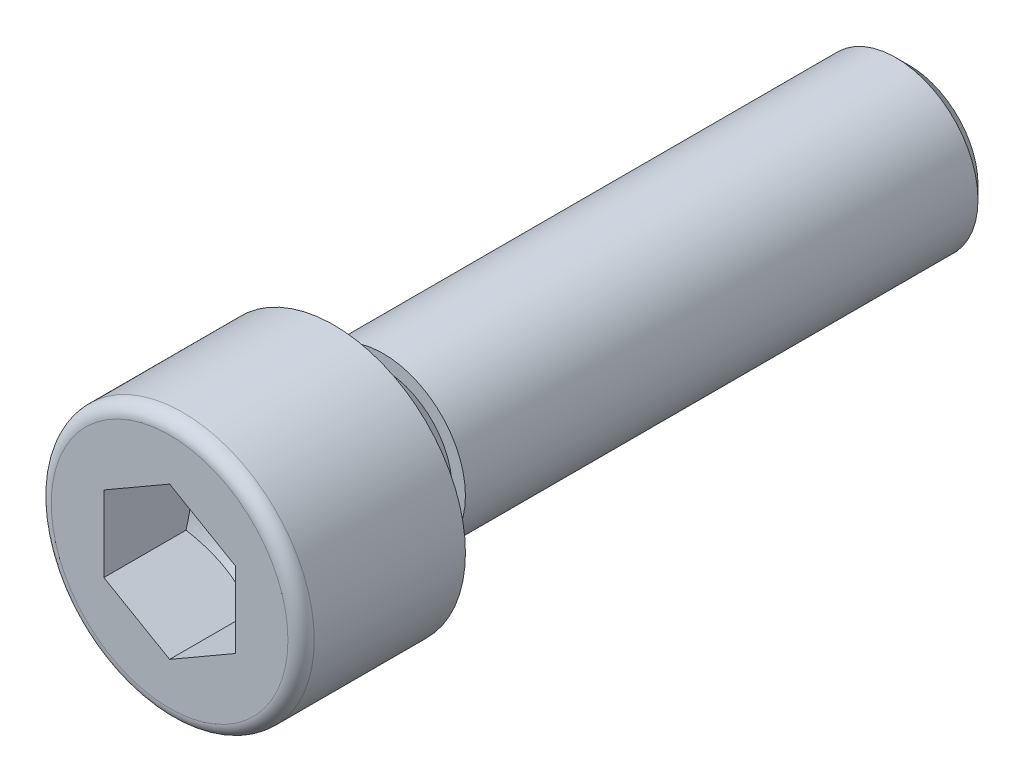
ISO-10303-21;
HEADER;
FILE_DESCRIPTION(('STEP AP214'),'2;1');
FILE_NAME('part.step','',(''),(''),'','','');
FILE_SCHEMA(('AUTOMOTIVE_DESIGN { 1 0 10303 214 1 1 1 1 }'));
ENDSEC;
DATA;
#1=APPLICATION_CONTEXT('core data for automotive mechanical design processes');
#2=APPLICATION_PROTOCOL_DEFINITION('international standard','automotive_design',2000,#1);
#3=PRODUCT_CONTEXT('',#1,'mechanical');
#4=PRODUCT('Part','Part','',(#3));
#5=PRODUCT_RELATED_PRODUCT_CATEGORY('part','',(#4));
#6=PRODUCT_DEFINITION_FORMATION('','',#4);
#7=PRODUCT_DEFINITION_CONTEXT('part definition',#1,'design');
#8=PRODUCT_DEFINITION('design','',#6,#7);
#9=PRODUCT_DEFINITION_SHAPE('','',#8);
#10=(LENGTH_UNIT() NAMED_UNIT(*) SI_UNIT(.MILLI.,.METRE.));
#11=(NAMED_UNIT(*) PLANE_ANGLE_UNIT() SI_UNIT($,.RADIAN.));
#12=(NAMED_UNIT(*) SI_UNIT($,.STERADIAN.) SOLID_ANGLE_UNIT());
#13=UNCERTAINTY_MEASURE_WITH_UNIT(LENGTH_MEASURE(1.E-05),#10,'distance_accuracy_value','');
#14=(GEOMETRIC_REPRESENTATION_CONTEXT(3) GLOBAL_UNCERTAINTY_ASSIGNED_CONTEXT((#13)) GLOBAL_UNIT_ASSIGNED_CONTEXT((#10,
#11,#12)) REPRESENTATION_CONTEXT('',''));
#15=CARTESIAN_POINT('',(0.,0.,0.));
#16=DIRECTION('',(0.,0.,1.));
#17=DIRECTION('',(1.,0.,0.));
#18=AXIS2_PLACEMENT_3D('',#15,#16,#17);
#19=CARTESIAN_POINT('',(0.,0.,10.));
#20=DIRECTION('',(0.,0.,1.));
#21=DIRECTION('',(1.,0.,0.));
#22=AXIS2_PLACEMENT_3D('',#19,#20,#21);
#23=PLANE('',#22);
#24=CARTESIAN_POINT('',(0.,0.,10.));
#25=DIRECTION('',(0.,0.,1.));
#26=DIRECTION('',(1.,0.,0.));
#27=AXIS2_PLACEMENT_3D('',#24,#25,#26);
#28=CIRCLE('',#27,7.2);
#29=CARTESIAN_POINT('',(7.2,0.,10.));
#30=VERTEX_POINT('',#29);
#31=EDGE_CURVE('E11',#30,#30,#28,.T.);
#32=ORIENTED_EDGE('',*,*,#31,.T.);
#33=EDGE_LOOP('',(#32));
#34=FACE_BOUND('',#33,.T.);
#35=DIRECTION('',(0.,-1.,0.));
#36=VECTOR('',#35,1.);
#37=CARTESIAN_POINT('',(3.99999813499956,2.3094,10.));
#38=LINE('',#37,#36);
#39=CARTESIAN_POINT('',(3.99999813499956,2.3094,10.));
#40=VERTEX_POINT('',#39);
#41=CARTESIAN_POINT('',(3.99999813499957,-2.3094,10.));
#42=VERTEX_POINT('',#41);
#43=EDGE_CURVE('E92',#40,#42,#38,.T.);
#44=ORIENTED_EDGE('',*,*,#43,.T.);
#45=DIRECTION('',(-0.866025403784438,-0.5,0.));
#46=VECTOR('',#45,1.);
#47=CARTESIAN_POINT('',(3.99999813499957,-2.3094,10.));
#48=LINE('',#47,#46);
#49=CARTESIAN_POINT('',(0.,-4.6188,10.));
#50=VERTEX_POINT('',#49);
#51=EDGE_CURVE('E31',#42,#50,#48,.T.);
#52=ORIENTED_EDGE('',*,*,#51,.T.);
#53=DIRECTION('',(-0.866025403784439,0.5,0.));
#54=VECTOR('',#53,1.);
#55=CARTESIAN_POINT('',(0.,-4.6188,10.));
#56=LINE('',#55,#54);
#57=CARTESIAN_POINT('',(-3.99999813499956,-2.3094,10.));
#58=VERTEX_POINT('',#57);
#59=EDGE_CURVE('E169',#50,#58,#56,.T.);
#60=ORIENTED_EDGE('',*,*,#59,.T.);
#61=DIRECTION('',(0.,1.,0.));
#62=VECTOR('',#61,1.);
#63=CARTESIAN_POINT('',(-3.99999813499956,-2.3094,10.));
#64=LINE('',#63,#62);
#65=CARTESIAN_POINT('',(-3.99999813499956,2.3094,10.));
#66=VERTEX_POINT('',#65);
#67=EDGE_CURVE('E165',#58,#66,#64,.T.);
#68=ORIENTED_EDGE('',*,*,#67,.T.);
#69=DIRECTION('',(0.866025403784439,0.5,0.));
#70=VECTOR('',#69,1.);
#71=CARTESIAN_POINT('',(-3.99999813499956,2.3094,10.));
#72=LINE('',#71,#70);
#73=CARTESIAN_POINT('',(0.,4.6188,10.));
#74=VERTEX_POINT('',#73);
#75=EDGE_CURVE('E160',#66,#74,#72,.T.);
#76=ORIENTED_EDGE('',*,*,#75,.T.);
#77=DIRECTION('',(0.866025403784439,-0.5,0.));
#78=VECTOR('',#77,1.);
#79=CARTESIAN_POINT('',(0.,4.6188,10.));
#80=LINE('',#79,#78);
#81=EDGE_CURVE('E96',#74,#40,#80,.T.);
#82=ORIENTED_EDGE('',*,*,#81,.T.);
#83=EDGE_LOOP('',(#44,#52,#60,#68,#76,#82));
#84=FACE_BOUND('',#83,.T.);
#85=ADVANCED_FACE('F17',(#34,#84),#23,.T.);
#86=CARTESIAN_POINT('',(0.,0.,9.2));
#87=DIRECTION('',(0.,0.,1.));
#88=DIRECTION('',(1.,0.,0.));
#89=AXIS2_PLACEMENT_3D('',#86,#87,#88);
#90=TOROIDAL_SURFACE('',#89,7.2,0.8);
#91=ORIENTED_EDGE('',*,*,#31,.F.);
#92=EDGE_LOOP('',(#91));
#93=FACE_BOUND('',#92,.T.);
#94=CARTESIAN_POINT('',(0.,0.,9.2));
#95=DIRECTION('',(0.,0.,1.));
#96=DIRECTION('',(1.,0.,0.));
#97=AXIS2_PLACEMENT_3D('',#94,#95,#96);
#98=CIRCLE('',#97,8.);
#99=CARTESIAN_POINT('',(8.,0.,9.2));
#100=VERTEX_POINT('',#99);
#101=EDGE_CURVE('E24',#100,#100,#98,.T.);
#102=ORIENTED_EDGE('',*,*,#101,.T.);
#103=EDGE_LOOP('',(#102));
#104=FACE_BOUND('',#103,.T.);
#105=ADVANCED_FACE('F133',(#93,#104),#90,.T.);
#106=CARTESIAN_POINT('',(0.,0.,10.));
#107=DIRECTION('',(0.,0.,1.));
#108=DIRECTION('',(1.,0.,0.));
#109=AXIS2_PLACEMENT_3D('',#106,#107,#108);
#110=CYLINDRICAL_SURFACE('',#109,8.);
#111=CARTESIAN_POINT('',(0.,0.,0.));
#112=DIRECTION('',(0.,0.,1.));
#113=DIRECTION('',(1.,0.,0.));
#114=AXIS2_PLACEMENT_3D('',#111,#112,#113);
#115=CIRCLE('',#114,8.);
#116=CARTESIAN_POINT('',(8.,0.,0.));
#117=VERTEX_POINT('',#116);
#118=EDGE_CURVE('E128',#117,#117,#115,.T.);
#119=ORIENTED_EDGE('',*,*,#118,.T.);
#120=EDGE_LOOP('',(#119));
#121=FACE_BOUND('',#120,.T.);
#122=ORIENTED_EDGE('',*,*,#101,.F.);
#123=EDGE_LOOP('',(#122));
#124=FACE_BOUND('',#123,.T.);
#125=ADVANCED_FACE('F135',(#121,#124),#110,.T.);
#126=CARTESIAN_POINT('',(0.,8.,0.));
#127=DIRECTION('',(0.,0.,-1.));
#128=DIRECTION('',(-1.,0.,0.));
#129=AXIS2_PLACEMENT_3D('',#126,#127,#128);
#130=PLANE('',#129);
#131=CARTESIAN_POINT('',(0.,0.,0.));
#132=DIRECTION('',(0.,0.,1.));
#133=DIRECTION('',(1.,0.,0.));
#134=AXIS2_PLACEMENT_3D('',#131,#132,#133);
#135=CIRCLE('',#134,5.5);
#136=CARTESIAN_POINT('',(5.5,0.,0.));
#137=VERTEX_POINT('',#136);
#138=EDGE_CURVE('E125',#137,#137,#135,.T.);
#139=ORIENTED_EDGE('',*,*,#138,.T.);
#140=EDGE_LOOP('',(#139));
#141=FACE_BOUND('',#140,.T.);
#142=ORIENTED_EDGE('',*,*,#118,.F.);
#143=EDGE_LOOP('',(#142));
#144=FACE_BOUND('',#143,.T.);
#145=ADVANCED_FACE('F137',(#141,#144),#130,.T.);
#146=CARTESIAN_POINT('',(0.,0.,-0.5));
#147=DIRECTION('',(0.,0.,1.));
#148=DIRECTION('',(1.,0.,0.));
#149=AXIS2_PLACEMENT_3D('',#146,#147,#148);
#150=TOROIDAL_SURFACE('',#149,5.5,0.5);
#151=CARTESIAN_POINT('',(0.,0.,-0.5));
#152=DIRECTION('',(0.,0.,1.));
#153=DIRECTION('',(1.,0.,0.));
#154=AXIS2_PLACEMENT_3D('',#151,#152,#153);
#155=CIRCLE('',#154,5.);
#156=CARTESIAN_POINT('',(5.,0.,-0.5));
#157=VERTEX_POINT('',#156);
#158=EDGE_CURVE('E122',#157,#157,#155,.T.);
#159=ORIENTED_EDGE('',*,*,#158,.T.);
#160=EDGE_LOOP('',(#159));
#161=FACE_BOUND('',#160,.T.);
#162=ORIENTED_EDGE('',*,*,#138,.F.);
#163=EDGE_LOOP('',(#162));
#164=FACE_BOUND('',#163,.T.);
#165=ADVANCED_FACE('F145',(#161,#164),#150,.F.);
#166=CARTESIAN_POINT('',(0.,0.,10.));
#167=DIRECTION('',(0.,0.,1.));
#168=DIRECTION('',(1.,0.,0.));
#169=AXIS2_PLACEMENT_3D('',#166,#167,#168);
#170=CYLINDRICAL_SURFACE('',#169,5.);
#171=CARTESIAN_POINT('',(0.,0.,-1.59379125060502));
#172=DIRECTION('',(0.,0.,1.));
#173=DIRECTION('',(1.,0.,0.));
#174=AXIS2_PLACEMENT_3D('',#171,#172,#173);
#175=CIRCLE('',#174,5.);
#176=CARTESIAN_POINT('',(5.,0.,-1.59379125060502));
#177=VERTEX_POINT('',#176);
#178=EDGE_CURVE('E119',#177,#177,#175,.T.);
#179=ORIENTED_EDGE('',*,*,#178,.T.);
#180=EDGE_LOOP('',(#179));
#181=FACE_BOUND('',#180,.T.);
#182=ORIENTED_EDGE('',*,*,#158,.F.);
#183=EDGE_LOOP('',(#182));
#184=FACE_BOUND('',#183,.T.);
#185=ADVANCED_FACE('F325',(#181,#184),#170,.T.);
#186=CARTESIAN_POINT('',(0.,0.,-1.59379125060502));
#187=DIRECTION('',(0.,0.,1.));
#188=DIRECTION('',(1.,0.,0.));
#189=AXIS2_PLACEMENT_3D('',#186,#187,#188);
#190=CONICAL_SURFACE('',#189,5.,0.523598775598299);
#191=CARTESIAN_POINT('',(0.,0.,-3.));
#192=DIRECTION('',(0.,0.,1.));
#193=DIRECTION('',(1.,0.,0.));
#194=AXIS2_PLACEMENT_3D('',#191,#192,#193);
#195=CIRCLE('',#194,4.188125);
#196=CARTESIAN_POINT('',(4.188125,0.,-3.));
#197=VERTEX_POINT('',#196);
#198=EDGE_CURVE('E116',#197,#197,#195,.T.);
#199=ORIENTED_EDGE('',*,*,#198,.T.);
#200=EDGE_LOOP('',(#199));
#201=FACE_BOUND('',#200,.T.);
#202=ORIENTED_EDGE('',*,*,#178,.F.);
#203=EDGE_LOOP('',(#202));
#204=FACE_BOUND('',#203,.T.);
#205=ADVANCED_FACE('F316',(#201,#204),#190,.T.);
#206=CARTESIAN_POINT('',(0.,4.188125,-3.));
#207=DIRECTION('',(0.,0.,1.));
#208=DIRECTION('',(1.,0.,0.));
#209=AXIS2_PLACEMENT_3D('',#206,#207,#208);
#210=PLANE('',#209);
#211=CARTESIAN_POINT('',(0.,0.,-3.));
#212=DIRECTION('',(0.,0.,1.));
#213=DIRECTION('',(1.,0.,0.));
#214=AXIS2_PLACEMENT_3D('',#211,#212,#213);
#215=CIRCLE('',#214,5.);
#216=CARTESIAN_POINT('',(5.,0.,-3.));
#217=VERTEX_POINT('',#216);
#218=EDGE_CURVE('E113',#217,#217,#215,.T.);
#219=ORIENTED_EDGE('',*,*,#218,.T.);
#220=EDGE_LOOP('',(#219));
#221=FACE_BOUND('',#220,.T.);
#222=ORIENTED_EDGE('',*,*,#198,.F.);
#223=EDGE_LOOP('',(#222));
#224=FACE_BOUND('',#223,.T.);
#225=ADVANCED_FACE('F302',(#221,#224),#210,.T.);
#226=CARTESIAN_POINT('',(0.,0.,10.));
#227=DIRECTION('',(0.,0.,1.));
#228=DIRECTION('',(1.,0.,0.));
#229=AXIS2_PLACEMENT_3D('',#226,#227,#228);
#230=CYLINDRICAL_SURFACE('',#229,5.);
#231=CARTESIAN_POINT('',(0.,0.,-34.188125));
#232=DIRECTION('',(0.,0.,1.));
#233=DIRECTION('',(1.,0.,0.));
#234=AXIS2_PLACEMENT_3D('',#231,#232,#233);
#235=CIRCLE('',#234,5.);
#236=CARTESIAN_POINT('',(5.,0.,-34.188125));
#237=VERTEX_POINT('',#236);
#238=EDGE_CURVE('E110',#237,#237,#235,.T.);
#239=ORIENTED_EDGE('',*,*,#238,.T.);
#240=EDGE_LOOP('',(#239));
#241=FACE_BOUND('',#240,.T.);
#242=ORIENTED_EDGE('',*,*,#218,.F.);
#243=EDGE_LOOP('',(#242));
#244=FACE_BOUND('',#243,.T.);
#245=ADVANCED_FACE('F292',(#241,#244),#230,.T.);
#246=CARTESIAN_POINT('',(0.,0.,-34.188125));
#247=DIRECTION('',(0.,0.,1.));
#248=DIRECTION('',(1.,0.,0.));
#249=AXIS2_PLACEMENT_3D('',#246,#247,#248);
#250=CONICAL_SURFACE('',#249,5.,0.785398163397448);
#251=CARTESIAN_POINT('',(0.,0.,-35.));
#252=DIRECTION('',(0.,0.,1.));
#253=DIRECTION('',(1.,0.,0.));
#254=AXIS2_PLACEMENT_3D('',#251,#252,#253);
#255=CIRCLE('',#254,4.188125);
#256=CARTESIAN_POINT('',(4.188125,0.,-35.));
#257=VERTEX_POINT('',#256);
#258=EDGE_CURVE('E107',#257,#257,#255,.T.);
#259=ORIENTED_EDGE('',*,*,#258,.T.);
#260=EDGE_LOOP('',(#259));
#261=FACE_BOUND('',#260,.T.);
#262=ORIENTED_EDGE('',*,*,#238,.F.);
#263=EDGE_LOOP('',(#262));
#264=FACE_BOUND('',#263,.T.);
#265=ADVANCED_FACE('F284',(#261,#264),#250,.T.);
#266=CARTESIAN_POINT('',(0.,4.188125,-35.));
#267=DIRECTION('',(0.,0.,-1.));
#268=DIRECTION('',(-1.,0.,0.));
#269=AXIS2_PLACEMENT_3D('',#266,#267,#268);
#270=PLANE('',#269);
#271=ORIENTED_EDGE('',*,*,#258,.F.);
#272=EDGE_LOOP('',(#271));
#273=FACE_BOUND('',#272,.T.);
#274=ADVANCED_FACE('F225',(#273),#270,.T.);
#275=CARTESIAN_POINT('',(3.99999813499957,-2.3094,2.33333457666696));
#276=DIRECTION('',(-0.5,0.866025403784439,0.));
#277=DIRECTION('',(0.866025403784438,0.5,0.));
#278=AXIS2_PLACEMENT_3D('',#275,#276,#277);
#279=PLANE('',#278);
#280=DIRECTION('',(0.,0.,1.));
#281=VECTOR('',#280,1.);
#282=CARTESIAN_POINT('',(0.,-4.6188,2.33333457666696));
#283=LINE('',#282,#281);
#284=CARTESIAN_POINT('',(0.,-4.6188,5.));
#285=VERTEX_POINT('',#284);
#286=EDGE_CURVE('E105',#285,#50,#283,.T.);
#287=ORIENTED_EDGE('',*,*,#286,.T.);
#288=ORIENTED_EDGE('',*,*,#51,.F.);
#289=DIRECTION('',(0.,0.,1.));
#290=VECTOR('',#289,1.);
#291=CARTESIAN_POINT('',(3.99999813499957,-2.3094,2.33333457666696));
#292=LINE('',#291,#290);
#293=CARTESIAN_POINT('',(3.99999813499957,-2.3094,5.));
#294=VERTEX_POINT('',#293);
#295=EDGE_CURVE('E86',#294,#42,#292,.T.);
#296=ORIENTED_EDGE('',*,*,#295,.F.);
#297=CARTESIAN_POINT('',(-1.9999999914715E-07,-4.61880011547006,5.00000006666667));
#298=CARTESIAN_POINT('',(0.175775496545669,-4.51731596975242,4.94139117877067));
#299=CARTESIAN_POINT('',(0.353068486395855,-4.41495581433698,4.88808946175357));
#300=CARTESIAN_POINT('',(0.710724175896032,-4.20846320572685,4.7950529136606));
#301=CARTESIAN_POINT('',(0.891093228328859,-4.10432708475128,4.75535099179967));
#302=CARTESIAN_POINT('',(1.24959610984346,-3.89734534960357,4.69355208547845));
#303=CARTESIAN_POINT('',(1.42767479409974,-3.79453157331127,4.67104374713357));
#304=CARTESIAN_POINT('',(1.78466964489627,-3.58842050010459,4.64417850885721));
#305=CARTESIAN_POINT('',(1.96358451474684,-3.48512395183433,4.63979935685316));
#306=CARTESIAN_POINT('',(2.29786778189951,-3.29212541755815,4.648932735896));
#307=CARTESIAN_POINT('',(2.45328634101981,-3.20239447061298,4.66020271965585));
#308=CARTESIAN_POINT('',(2.76311095799946,-3.02351714459821,4.69591473701546));
#309=CARTESIAN_POINT('',(2.91751594505726,-2.93437138375617,4.72036895784161));
#310=CARTESIAN_POINT('',(3.2279788304468,-2.75512555330313,4.78149977936056));
#311=CARTESIAN_POINT('',(3.38399745531408,-2.66504815823741,4.81843538881991));
#312=CARTESIAN_POINT('',(3.69370835971222,-2.48623648421218,4.90226360820785));
#313=CARTESIAN_POINT('',(3.84740460393987,-2.39749991623391,4.94913653447237));
#314=CARTESIAN_POINT('',(3.99999833499957,-2.30939988452995,5.00000006666667));
#315=B_SPLINE_CURVE_WITH_KNOTS('',3,(#297,#298,#299,#300,#301,#302,#303,#304,#305,#306,#307,
#308,#309,#310,#311,#312,#313,#314),.UNSPECIFIED.,.F.,.F.,(4,2,2,2,2,2,2,2,4),(0.,
0.634031743308239,1.26958707416591,1.88941437772396,2.50848066870244,3.047414307093,
3.58684698049291,4.13824168880611,4.6885542415222),.UNSPECIFIED.);
#316=EDGE_CURVE('E79',#285,#294,#315,.T.);
#317=ORIENTED_EDGE('',*,*,#316,.F.);
#318=EDGE_LOOP('',(#287,#288,#296,#317));
#319=FACE_BOUND('',#318,.T.);
#320=ADVANCED_FACE('F87',(#319),#279,.T.);
#321=CARTESIAN_POINT('',(0.,-4.6188,2.33333457666696));
#322=DIRECTION('',(0.5,0.866025403784439,0.));
#323=DIRECTION('',(0.866025403784439,-0.5,0.));
#324=AXIS2_PLACEMENT_3D('',#321,#322,#323);
#325=PLANE('',#324);
#326=DIRECTION('',(0.,0.,1.));
#327=VECTOR('',#326,1.);
#328=CARTESIAN_POINT('',(-3.99999813499956,-2.3094,2.33333457666696));
#329=LINE('',#328,#327);
#330=CARTESIAN_POINT('',(-3.99999813499956,-2.3094,5.));
#331=VERTEX_POINT('',#330);
#332=EDGE_CURVE('E103',#331,#58,#329,.T.);
#333=ORIENTED_EDGE('',*,*,#332,.T.);
#334=ORIENTED_EDGE('',*,*,#59,.F.);
#335=ORIENTED_EDGE('',*,*,#286,.F.);
#336=CARTESIAN_POINT('',(-3.99999833499956,-2.30939988452995,5.00000006666667));
#337=CARTESIAN_POINT('',(-3.8242226384539,-2.41088403024758,4.94139117877067));
#338=CARTESIAN_POINT('',(-3.64692964860371,-2.51324418566302,4.88808946175356));
#339=CARTESIAN_POINT('',(-3.28927395910353,-2.71973679427315,4.7950529136606));
#340=CARTESIAN_POINT('',(-3.10890490667071,-2.82387291524872,4.75535099179967));
#341=CARTESIAN_POINT('',(-2.7504020251561,-3.03085465039643,4.69355208547845));
#342=CARTESIAN_POINT('',(-2.57232334089982,-3.13366842668873,4.67104374713356));
#343=CARTESIAN_POINT('',(-2.21532849010329,-3.33977949989542,4.64417850885721));
#344=CARTESIAN_POINT('',(-2.03641362025272,-3.44307604816567,4.63979935685316));
#345=CARTESIAN_POINT('',(-1.70213035310006,-3.63607458244185,4.648932735896));
#346=CARTESIAN_POINT('',(-1.54671179397975,-3.72580552938702,4.66020271965585));
#347=CARTESIAN_POINT('',(-1.23688717700011,-3.90468285540179,4.69591473701545));
#348=CARTESIAN_POINT('',(-1.0824821899423,-3.99382861624383,4.72036895784161));
#349=CARTESIAN_POINT('',(-0.772019304552766,-4.17307444669687,4.78149977936055));
#350=CARTESIAN_POINT('',(-0.616000679685488,-4.26315184176259,4.8184353888199));
#351=CARTESIAN_POINT('',(-0.306289775287343,-4.44196351578782,4.90226360820785));
#352=CARTESIAN_POINT('',(-0.152593531059701,-4.53070008376609,4.94913653447237));
#353=CARTESIAN_POINT('',(2.00000001328189E-07,-4.61880011547006,5.00000006666667));
#354=B_SPLINE_CURVE_WITH_KNOTS('',3,(#336,#337,#338,#339,#340,#341,#342,#343,#344,#345,#346,
#347,#348,#349,#350,#351,#352,#353),.UNSPECIFIED.,.F.,.F.,(4,2,2,2,2,2,2,2,4),(0.,
0.634031743308237,1.26958707416591,1.88941437772395,2.50848066870243,3.04741430709299,
3.58684698049291,4.13824168880611,4.6885542415222),.UNSPECIFIED.);
#355=EDGE_CURVE('E83',#331,#285,#354,.T.);
#356=ORIENTED_EDGE('',*,*,#355,.F.);
#357=EDGE_LOOP('',(#333,#334,#335,#356));
#358=FACE_BOUND('',#357,.T.);
#359=ADVANCED_FACE('F216',(#358),#325,.T.);
#360=CARTESIAN_POINT('',(-3.99999813499956,-2.3094,2.33333457666696));
#361=DIRECTION('',(1.,0.,0.));
#362=DIRECTION('',(0.,-1.,0.));
#363=AXIS2_PLACEMENT_3D('',#360,#361,#362);
#364=PLANE('',#363);
#365=DIRECTION('',(0.,0.,1.));
#366=VECTOR('',#365,1.);
#367=CARTESIAN_POINT('',(-3.99999813499956,2.3094,2.33333457666696));
#368=LINE('',#367,#366);
#369=CARTESIAN_POINT('',(-3.99999813499957,2.3094,5.));
#370=VERTEX_POINT('',#369);
#371=EDGE_CURVE('E101',#370,#66,#368,.T.);
#372=ORIENTED_EDGE('',*,*,#371,.T.);
#373=ORIENTED_EDGE('',*,*,#67,.F.);
#374=ORIENTED_EDGE('',*,*,#332,.F.);
#375=CARTESIAN_POINT('',(-3.99999813499956,-5.98057769943966,6.48734046251718));
#376=CARTESIAN_POINT('',(-3.99999813499956,-5.80784400243562,6.40446937097848));
#377=CARTESIAN_POINT('',(-3.99999813499956,-5.63468950254882,6.32245904484909));
#378=CARTESIAN_POINT('',(-3.99999813499956,-5.28731462602685,6.16064822390903));
#379=CARTESIAN_POINT('',(-3.99999813499956,-5.11309406440309,6.08084812671642));
#380=CARTESIAN_POINT('',(-3.99999813499956,-4.76236385157732,5.92350025356516));
#381=CARTESIAN_POINT('',(-3.99999813499956,-4.58584672543334,5.84596907665737));
#382=CARTESIAN_POINT('',(-3.99999813499956,-4.23133125143679,5.69438341230607));
#383=CARTESIAN_POINT('',(-3.99999813499956,-4.05333298112083,5.6203287442016));
#384=CARTESIAN_POINT('',(-3.99999813499956,-3.69088328504018,5.47473611767175));
#385=CARTESIAN_POINT('',(-3.99999813499956,-3.50638481622635,5.40331458402694));
#386=CARTESIAN_POINT('',(-3.99999813499956,-3.13515624652408,5.26640956950147));
#387=CARTESIAN_POINT('',(-3.99999813499956,-2.94842588982695,5.20092677682354));
#388=CARTESIAN_POINT('',(-3.99999813499956,-2.57285948272996,5.0777691150504));
#389=CARTESIAN_POINT('',(-3.99999813499956,-2.38402930872232,5.02007651906984));
#390=CARTESIAN_POINT('',(-3.99999813499956,-2.00367935718944,4.91448049814724));
#391=CARTESIAN_POINT('',(-3.99999813499956,-1.8121605068445,4.86657378309588));
#392=CARTESIAN_POINT('',(-3.99999813499956,-1.42680740094585,4.78309490569871));
#393=CARTESIAN_POINT('',(-3.99999813499957,-1.23297862430077,4.74749794322088));
#394=CARTESIAN_POINT('',(-3.99999813499957,-0.843152542519165,4.69097243951497));
#395=CARTESIAN_POINT('',(-3.99999813499957,-0.647155384835093,4.67004290703676));
#396=CARTESIAN_POINT('',(-3.99999813499957,-0.256426116782558,4.64479411430008));
#397=CARTESIAN_POINT('',(-3.99999813499957,-0.0617069861013698,4.64027884161518));
#398=CARTESIAN_POINT('',(-3.99999813499957,0.327426906211066,4.64773742399229));
#399=CARTESIAN_POINT('',(-3.99999813499956,0.52184164824962,4.65971230005794));
#400=CARTESIAN_POINT('',(-3.99999813499956,0.858491735769643,4.6939190923976));
#401=CARTESIAN_POINT('',(-3.99999813499957,1.00109922314035,4.71265719181161));
#402=CARTESIAN_POINT('',(-3.99999813499957,1.28511976458077,4.75771669794158));
#403=CARTESIAN_POINT('',(-3.99999813499957,1.42653262307773,4.78403932247236));
#404=CARTESIAN_POINT('',(-3.99999813499957,1.84886975668172,4.87298366302312));
#405=CARTESIAN_POINT('',(-3.99999813499957,2.12771265313489,4.94556130672587));
#406=CARTESIAN_POINT('',(-3.99999813499957,2.5446328627064,5.06954539184547));
#407=CARTESIAN_POINT('',(-3.99999813499957,2.68490831283008,5.1139651780313));
#408=CARTESIAN_POINT('',(-3.99999813499957,2.9640950381145,5.20694071066586));
#409=CARTESIAN_POINT('',(-3.99999813499957,3.10300630347461,5.25549648680429));
#410=CARTESIAN_POINT('',(-3.99999813499957,3.37952018424764,5.35600487440857));
#411=CARTESIAN_POINT('',(-3.99999813499957,3.5171233031956,5.40795611276849));
#412=CARTESIAN_POINT('',(-3.99999813499957,3.79122042178779,5.51469226903659));
#413=CARTESIAN_POINT('',(-3.99999813499957,3.92771443968266,5.56947714020664));
#414=CARTESIAN_POINT('',(-3.99999813499956,4.27613178319514,5.71283314106718));
#415=CARTESIAN_POINT('',(-3.99999813499957,4.48735789030203,5.80309663102804));
#416=CARTESIAN_POINT('',(-3.99999813499957,4.90790709868654,5.98796593595749));
#417=CARTESIAN_POINT('',(-3.99999813499957,5.11723005648614,6.08257207511811));
#418=CARTESIAN_POINT('',(-3.99999813499957,5.53437999946508,6.27514679204428));
#419=CARTESIAN_POINT('',(-3.99999813499957,5.74220661501422,6.37311616831132));
#420=CARTESIAN_POINT('',(-3.99999813499957,6.15660816985254,6.57167140260444));
#421=CARTESIAN_POINT('',(-3.99999813499957,6.3631830811763,6.67225731882512));
#422=CARTESIAN_POINT('',(-3.99999813499957,6.98187215028834,6.97733233243375));
#423=CARTESIAN_POINT('',(-3.99999813499957,7.39246201516086,7.18490974427113));
#424=CARTESIAN_POINT('',(-3.99999813499957,8.21082346769403,7.60536973499901));
#425=CARTESIAN_POINT('',(-3.99999813499957,8.6185954514455,7.81825154807916));
#426=CARTESIAN_POINT('',(-3.99999813499957,9.39379812314143,8.22743350422465));
#427=CARTESIAN_POINT('',(-3.99999813499957,9.7614039577413,8.42340236163408));
#428=CARTESIAN_POINT('',(-3.99999813499957,10.4954352557594,8.81757227607729));
#429=CARTESIAN_POINT('',(-3.99999813499957,10.861860668265,9.01577342777696));
#430=CARTESIAN_POINT('',(-3.99999813499957,11.5928695559467,9.41334281805624));
#431=CARTESIAN_POINT('',(-3.99999813499957,11.9574553455399,9.61270680585057));
#432=CARTESIAN_POINT('',(-3.99999813499957,12.6858878471355,10.0127312806838));
#433=CARTESIAN_POINT('',(-3.99999813499957,13.049734600593,10.2133916922052));
#434=CARTESIAN_POINT('',(-3.99999813499957,13.4133165572192,10.4145276846218));
#435=B_SPLINE_CURVE_WITH_KNOTS('',3,(#375,#376,#377,#378,#379,#380,#381,#382,#383,#384,#385,
#386,#387,#388,#389,#390,#391,#392,#393,#394,#395,#396,#397,#398,#399,#400,#401,#402,#403,#404,
#405,#406,#407,#408,#409,#410,#411,#412,#413,#414,#415,#416,#417,#418,#419,#420,#421,#422,#423,
#424,#425,#426,#427,#428,#429,#430,#431,#432,#433,#434),.UNSPECIFIED.,.F.,.F.,(4,2,2,2,2,2,2,2,
2,2,2,2,2,2,2,2,2,2,2,2,2,2,2,2,2,2,2,2,2,4),(0.,0.574761100330722,1.14962493673432,
1.7279759181364,2.30629681148786,2.89973831384002,3.49324849869455,4.08538451139562,
4.67732111328469,5.26805811178858,5.85875518341986,6.44237478079685,7.02603051517532,
7.45731714312392,7.88867305955223,8.75192580750477,9.1933161173212,9.63470959587244,
10.0759256687618,10.5171344665229,11.2061762350659,11.8952695266067,12.5845275701603,
13.2738009566684,14.6539662082162,16.0339333431797,17.2836591241271,18.5334381037951,
19.7800382368413,21.0265663978729),.UNSPECIFIED.);
#436=EDGE_CURVE('E207',#370,#331,#435,.F.);
#437=ORIENTED_EDGE('',*,*,#436,.F.);
#438=EDGE_LOOP('',(#372,#373,#374,#437));
#439=FACE_BOUND('',#438,.T.);
#440=ADVANCED_FACE('F212',(#439),#364,.T.);
#441=CARTESIAN_POINT('',(-3.99999813499956,2.3094,2.33333457666696));
#442=DIRECTION('',(0.5,-0.866025403784438,0.));
#443=DIRECTION('',(-0.866025403784439,-0.5,0.));
#444=AXIS2_PLACEMENT_3D('',#441,#442,#443);
#445=PLANE('',#444);
#446=DIRECTION('',(0.,0.,1.));
#447=VECTOR('',#446,1.);
#448=CARTESIAN_POINT('',(0.,4.6188,2.33333457666696));
#449=LINE('',#448,#447);
#450=CARTESIAN_POINT('',(0.,4.6188,5.));
#451=VERTEX_POINT('',#450);
#452=EDGE_CURVE('E94',#451,#74,#449,.T.);
#453=ORIENTED_EDGE('',*,*,#452,.T.);
#454=ORIENTED_EDGE('',*,*,#75,.F.);
#455=ORIENTED_EDGE('',*,*,#371,.F.);
#456=CARTESIAN_POINT('',(2.00000001404972E-07,4.61880011547006,5.00000006666667));
#457=CARTESIAN_POINT('',(-0.175775496545667,4.51731596975242,4.94139117877067));
#458=CARTESIAN_POINT('',(-0.353068486395853,4.41495581433698,4.88808946175357));
#459=CARTESIAN_POINT('',(-0.710724175896029,4.20846320572685,4.7950529136606));
#460=CARTESIAN_POINT('',(-0.891093228328856,4.10432708475128,4.75535099179967));
#461=CARTESIAN_POINT('',(-1.24959610984346,3.89734534960357,4.69355208547845));
#462=CARTESIAN_POINT('',(-1.42767479409974,3.79453157331127,4.67104374713356));
#463=CARTESIAN_POINT('',(-1.78466964489627,3.58842050010459,4.64417850885721));
#464=CARTESIAN_POINT('',(-1.96358451474684,3.48512395183433,4.63979935685316));
#465=CARTESIAN_POINT('',(-2.2978677818995,3.29212541755815,4.648932735896));
#466=CARTESIAN_POINT('',(-2.45328634101981,3.20239447061298,4.66020271965585));
#467=CARTESIAN_POINT('',(-2.76311095799945,3.02351714459821,4.69591473701546));
#468=CARTESIAN_POINT('',(-2.91751594505726,2.93437138375617,4.72036895784161));
#469=CARTESIAN_POINT('',(-3.2279788304468,2.75512555330313,4.78149977936055));
#470=CARTESIAN_POINT('',(-3.38399745531407,2.66504815823741,4.8184353888199));
#471=CARTESIAN_POINT('',(-3.69370835971222,2.48623648421218,4.90226360820785));
#472=CARTESIAN_POINT('',(-3.84740460393986,2.39749991623392,4.94913653447236));
#473=CARTESIAN_POINT('',(-3.99999833499956,2.30939988452995,5.00000006666667));
#474=B_SPLINE_CURVE_WITH_KNOTS('',3,(#456,#457,#458,#459,#460,#461,#462,#463,#464,#465,#466,
#467,#468,#469,#470,#471,#472,#473),.UNSPECIFIED.,.F.,.F.,(4,2,2,2,2,2,2,2,4),(0.,
0.634031743308238,1.26958707416591,1.88941437772395,2.50848066870244,3.047414307093,
3.58684698049291,4.13824168880611,4.6885542415222),.UNSPECIFIED.);
#475=EDGE_CURVE('E202',#451,#370,#474,.T.);
#476=ORIENTED_EDGE('',*,*,#475,.F.);
#477=EDGE_LOOP('',(#453,#454,#455,#476));
#478=FACE_BOUND('',#477,.T.);
#479=ADVANCED_FACE('F215',(#478),#445,.T.);
#480=CARTESIAN_POINT('',(0.,4.6188,2.33333457666696));
#481=DIRECTION('',(-0.5,-0.866025403784439,0.));
#482=DIRECTION('',(-0.866025403784439,0.5,0.));
#483=AXIS2_PLACEMENT_3D('',#480,#481,#482);
#484=PLANE('',#483);
#485=DIRECTION('',(0.,0.,1.));
#486=VECTOR('',#485,1.);
#487=CARTESIAN_POINT('',(3.99999813499956,2.3094,2.33333457666696));
#488=LINE('',#487,#486);
#489=CARTESIAN_POINT('',(3.99999813499956,2.3094,5.));
#490=VERTEX_POINT('',#489);
#491=EDGE_CURVE('E91',#490,#40,#488,.T.);
#492=ORIENTED_EDGE('',*,*,#491,.T.);
#493=ORIENTED_EDGE('',*,*,#81,.F.);
#494=ORIENTED_EDGE('',*,*,#452,.F.);
#495=CARTESIAN_POINT('',(3.99999833499956,2.30939988452995,5.00000006666667));
#496=CARTESIAN_POINT('',(3.8242226384539,2.41088403024758,4.94139117877067));
#497=CARTESIAN_POINT('',(3.64692964860371,2.51324418566302,4.88808946175356));
#498=CARTESIAN_POINT('',(3.28927395910353,2.71973679427315,4.7950529136606));
#499=CARTESIAN_POINT('',(3.10890490667071,2.82387291524872,4.75535099179967));
#500=CARTESIAN_POINT('',(2.7504020251561,3.03085465039643,4.69355208547845));
#501=CARTESIAN_POINT('',(2.57232334089982,3.13366842668873,4.67104374713356));
#502=CARTESIAN_POINT('',(2.21532849010329,3.33977949989542,4.64417850885721));
#503=CARTESIAN_POINT('',(2.03641362025272,3.44307604816567,4.63979935685316));
#504=CARTESIAN_POINT('',(1.70213035310006,3.63607458244185,4.648932735896));
#505=CARTESIAN_POINT('',(1.54671179397975,3.72580552938702,4.66020271965585));
#506=CARTESIAN_POINT('',(1.23688717700011,3.90468285540179,4.69591473701546));
#507=CARTESIAN_POINT('',(1.08248218994231,3.99382861624383,4.72036895784161));
#508=CARTESIAN_POINT('',(0.772019304552769,4.17307444669687,4.78149977936055));
#509=CARTESIAN_POINT('',(0.616000679685491,4.26315184176259,4.8184353888199));
#510=CARTESIAN_POINT('',(0.306289775287347,4.44196351578782,4.90226360820785));
#511=CARTESIAN_POINT('',(0.152593531059704,4.53070008376608,4.94913653447236));
#512=CARTESIAN_POINT('',(-1.99999999190854E-07,4.61880011547005,5.00000006666667));
#513=B_SPLINE_CURVE_WITH_KNOTS('',3,(#495,#496,#497,#498,#499,#500,#501,#502,#503,#504,#505,
#506,#507,#508,#509,#510,#511,#512),.UNSPECIFIED.,.F.,.F.,(4,2,2,2,2,2,2,2,4),(0.,
0.634031743308237,1.26958707416591,1.88941437772395,2.50848066870243,3.04741430709299,
3.58684698049291,4.1382416888061,4.68855424152219),.UNSPECIFIED.);
#514=EDGE_CURVE('E39',#490,#451,#513,.T.);
#515=ORIENTED_EDGE('',*,*,#514,.F.);
#516=EDGE_LOOP('',(#492,#493,#494,#515));
#517=FACE_BOUND('',#516,.T.);
#518=ADVANCED_FACE('F159',(#517),#484,.T.);
#519=CARTESIAN_POINT('',(3.99999813499956,2.3094,2.33333457666696));
#520=DIRECTION('',(-1.,0.,0.));
#521=DIRECTION('',(0.,1.,0.));
#522=AXIS2_PLACEMENT_3D('',#519,#520,#521);
#523=PLANE('',#522);
#524=ORIENTED_EDGE('',*,*,#295,.T.);
#525=ORIENTED_EDGE('',*,*,#43,.F.);
#526=ORIENTED_EDGE('',*,*,#491,.F.);
#527=CARTESIAN_POINT('',(3.99999813499957,-5.98057769943966,6.48734046251718));
#528=CARTESIAN_POINT('',(3.99999813499957,-5.80784400243561,6.40446937097848));
#529=CARTESIAN_POINT('',(3.99999813499957,-5.63468950254882,6.32245904484909));
#530=CARTESIAN_POINT('',(3.99999813499957,-5.28731462602685,6.16064822390903));
#531=CARTESIAN_POINT('',(3.99999813499957,-5.11309406440309,6.08084812671642));
#532=CARTESIAN_POINT('',(3.99999813499957,-4.76236385157732,5.92350025356516));
#533=CARTESIAN_POINT('',(3.99999813499957,-4.58584672543334,5.84596907665737));
#534=CARTESIAN_POINT('',(3.99999813499957,-4.23133125143679,5.69438341230607));
#535=CARTESIAN_POINT('',(3.99999813499957,-4.05333298112082,5.6203287442016));
#536=CARTESIAN_POINT('',(3.99999813499957,-3.69088328504017,5.47473611767175));
#537=CARTESIAN_POINT('',(3.99999813499957,-3.50638481622635,5.40331458402694));
#538=CARTESIAN_POINT('',(3.99999813499957,-3.13515624652408,5.26640956950147));
#539=CARTESIAN_POINT('',(3.99999813499957,-2.94842588982694,5.20092677682354));
#540=CARTESIAN_POINT('',(3.99999813499957,-2.57285948272996,5.0777691150504));
#541=CARTESIAN_POINT('',(3.99999813499957,-2.38402930872231,5.02007651906984));
#542=CARTESIAN_POINT('',(3.99999813499957,-2.00367935718944,4.91448049814724));
#543=CARTESIAN_POINT('',(3.99999813499957,-1.81216050684449,4.86657378309588));
#544=CARTESIAN_POINT('',(3.99999813499957,-1.42680740094584,4.78309490569871));
#545=CARTESIAN_POINT('',(3.99999813499957,-1.23297862430077,4.74749794322088));
#546=CARTESIAN_POINT('',(3.99999813499957,-0.84315254251916,4.69097243951497));
#547=CARTESIAN_POINT('',(3.99999813499957,-0.647155384835088,4.67004290703676));
#548=CARTESIAN_POINT('',(3.99999813499957,-0.256426116782553,4.64479411430008));
#549=CARTESIAN_POINT('',(3.99999813499957,-0.0617069861013647,4.64027884161518));
#550=CARTESIAN_POINT('',(3.99999813499956,0.327426906211071,4.64773742399229));
#551=CARTESIAN_POINT('',(3.99999813499956,0.521841648249625,4.65971230005794));
#552=CARTESIAN_POINT('',(3.99999813499956,0.858491735769648,4.6939190923976));
#553=CARTESIAN_POINT('',(3.99999813499957,1.00109922314036,4.71265719181161));
#554=CARTESIAN_POINT('',(3.99999813499957,1.28511976458077,4.75771669794158));
#555=CARTESIAN_POINT('',(3.99999813499956,1.42653262307773,4.78403932247236));
#556=CARTESIAN_POINT('',(3.99999813499956,1.84886975668173,4.87298366302312));
#557=CARTESIAN_POINT('',(3.99999813499956,2.12771265313489,4.94556130672587));
#558=CARTESIAN_POINT('',(3.99999813499956,2.5446328627064,5.06954539184547));
#559=CARTESIAN_POINT('',(3.99999813499956,2.68490831283008,5.1139651780313));
#560=CARTESIAN_POINT('',(3.99999813499956,2.9640950381145,5.20694071066586));
#561=CARTESIAN_POINT('',(3.99999813499956,3.10300630347462,5.25549648680429));
#562=CARTESIAN_POINT('',(3.99999813499956,3.37952018424764,5.35600487440857));
#563=CARTESIAN_POINT('',(3.99999813499956,3.51712330319561,5.40795611276849));
#564=CARTESIAN_POINT('',(3.99999813499956,3.7912204217878,5.51469226903659));
#565=CARTESIAN_POINT('',(3.99999813499956,3.92771443968267,5.56947714020664));
#566=CARTESIAN_POINT('',(3.99999813499957,4.27613178319514,5.71283314106718));
#567=CARTESIAN_POINT('',(3.99999813499956,4.48735789030203,5.80309663102804));
#568=CARTESIAN_POINT('',(3.99999813499956,4.90790709868654,5.98796593595749));
#569=CARTESIAN_POINT('',(3.99999813499956,5.11723005648614,6.08257207511811));
#570=CARTESIAN_POINT('',(3.99999813499956,5.53437999946508,6.27514679204428));
#571=CARTESIAN_POINT('',(3.99999813499956,5.74220661501422,6.37311616831132));
#572=CARTESIAN_POINT('',(3.99999813499956,6.15660816985254,6.57167140260444));
#573=CARTESIAN_POINT('',(3.99999813499956,6.3631830811763,6.67225731882512));
#574=CARTESIAN_POINT('',(3.99999813499956,6.98187215028834,6.97733233243375));
#575=CARTESIAN_POINT('',(3.99999813499956,7.39246201516086,7.18490974427113));
#576=CARTESIAN_POINT('',(3.99999813499956,8.21082346769403,7.605369734999));
#577=CARTESIAN_POINT('',(3.99999813499956,8.6185954514455,7.81825154807916));
#578=CARTESIAN_POINT('',(3.99999813499956,9.39379812314143,8.22743350422465));
#579=CARTESIAN_POINT('',(3.99999813499956,9.7614039577413,8.42340236163407));
#580=CARTESIAN_POINT('',(3.99999813499956,10.4954352557594,8.81757227607729));
#581=CARTESIAN_POINT('',(3.99999813499956,10.861860668265,9.01577342777696));
#582=CARTESIAN_POINT('',(3.99999813499956,11.5928695559467,9.41334281805623));
#583=CARTESIAN_POINT('',(3.99999813499956,11.9574553455399,9.61270680585057));
#584=CARTESIAN_POINT('',(3.99999813499956,12.6858878471355,10.0127312806838));
#585=CARTESIAN_POINT('',(3.99999813499956,13.049734600593,10.2133916922052));
#586=CARTESIAN_POINT('',(3.99999813499955,13.4133165572192,10.4145276846218));
#587=B_SPLINE_CURVE_WITH_KNOTS('',3,(#527,#528,#529,#530,#531,#532,#533,#534,#535,#536,#537,
#538,#539,#540,#541,#542,#543,#544,#545,#546,#547,#548,#549,#550,#551,#552,#553,#554,#555,#556,
#557,#558,#559,#560,#561,#562,#563,#564,#565,#566,#567,#568,#569,#570,#571,#572,#573,#574,#575,
#576,#577,#578,#579,#580,#581,#582,#583,#584,#585,#586),.UNSPECIFIED.,.F.,.F.,(4,2,2,2,2,2,2,2,
2,2,2,2,2,2,2,2,2,2,2,2,2,2,2,2,2,2,2,2,2,4),(0.,0.574761100330722,1.14962493673432,
1.7279759181364,2.30629681148787,2.89973831384002,3.49324849869455,4.08538451139563,
4.67732111328469,5.26805811178858,5.85875518341986,6.44237478079686,7.02603051517532,
7.45731714312392,7.88867305955223,8.75192580750478,9.19331611732121,9.63470959587244,
10.0759256687618,10.5171344665229,11.2061762350659,11.8952695266067,12.5845275701603,
13.2738009566684,14.6539662082162,16.0339333431797,17.2836591241271,18.5334381037951,
19.7800382368413,21.0265663978729),.UNSPECIFIED.);
#588=EDGE_CURVE('E80',#294,#490,#587,.T.);
#589=ORIENTED_EDGE('',*,*,#588,.F.);
#590=EDGE_LOOP('',(#524,#525,#526,#589));
#591=FACE_BOUND('',#590,.T.);
#592=ADVANCED_FACE('F75',(#591),#523,.T.);
#593=CARTESIAN_POINT('',(0.,0.,2.33333457666696));
#594=DIRECTION('',(0.,0.,1.));
#595=DIRECTION('',(1.,0.,0.));
#596=AXIS2_PLACEMENT_3D('',#593,#594,#595);
#597=CONICAL_SURFACE('',#596,0.,1.0471975511966);
#598=CARTESIAN_POINT('',(0.,0.,2.33333457666696));
#599=VERTEX_POINT('',#598);
#600=VERTEX_LOOP('',#599);
#601=FACE_BOUND('',#600,.T.);
#602=ORIENTED_EDGE('',*,*,#316,.T.);
#603=ORIENTED_EDGE('',*,*,#588,.T.);
#604=ORIENTED_EDGE('',*,*,#514,.T.);
#605=ORIENTED_EDGE('',*,*,#475,.T.);
#606=ORIENTED_EDGE('',*,*,#436,.T.);
#607=ORIENTED_EDGE('',*,*,#355,.T.);
#608=EDGE_LOOP('',(#602,#603,#604,#605,#606,#607));
#609=FACE_BOUND('',#608,.T.);
#610=ADVANCED_FACE('F72',(#601,#609),#597,.F.);
#611=CLOSED_SHELL('',(#85,#105,#125,#145,#165,#185,#205,#225,#245,#265,#274,#320,#359,#440,#479,
#518,#592,#610));
#612=MANIFOLD_SOLID_BREP('B1',#611);
#613=ADVANCED_BREP_SHAPE_REPRESENTATION('',(#18,#612),#14);
#614=SHAPE_DEFINITION_REPRESENTATION(#9,#613);
ENDSEC;
END-ISO-10303-21;
